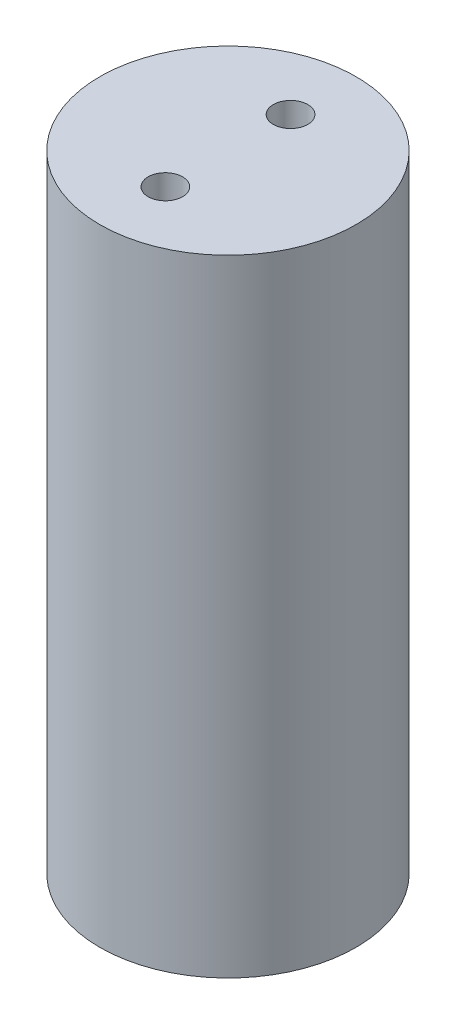
ISO-10303-21;
HEADER;
FILE_DESCRIPTION(('STEP AP214'),'2;1');
FILE_NAME('part.step','',(''),(''),'','','');
FILE_SCHEMA(('AUTOMOTIVE_DESIGN { 1 0 10303 214 1 1 1 1 }'));
ENDSEC;
DATA;
#1=APPLICATION_CONTEXT('core data for automotive mechanical design processes');
#2=APPLICATION_PROTOCOL_DEFINITION('international standard','automotive_design',2000,#1);
#3=PRODUCT_CONTEXT('',#1,'mechanical');
#4=PRODUCT('Part','Part','',(#3));
#5=PRODUCT_RELATED_PRODUCT_CATEGORY('part','',(#4));
#6=PRODUCT_DEFINITION_FORMATION('','',#4);
#7=PRODUCT_DEFINITION_CONTEXT('part definition',#1,'design');
#8=PRODUCT_DEFINITION('design','',#6,#7);
#9=PRODUCT_DEFINITION_SHAPE('','',#8);
#10=(LENGTH_UNIT() NAMED_UNIT(*) SI_UNIT(.MILLI.,.METRE.));
#11=(NAMED_UNIT(*) PLANE_ANGLE_UNIT() SI_UNIT($,.RADIAN.));
#12=(NAMED_UNIT(*) SI_UNIT($,.STERADIAN.) SOLID_ANGLE_UNIT());
#13=UNCERTAINTY_MEASURE_WITH_UNIT(LENGTH_MEASURE(1.E-05),#10,'distance_accuracy_value','');
#14=(GEOMETRIC_REPRESENTATION_CONTEXT(3) GLOBAL_UNCERTAINTY_ASSIGNED_CONTEXT((#13)) GLOBAL_UNIT_ASSIGNED_CONTEXT((#10,
#11,#12)) REPRESENTATION_CONTEXT('',''));
#15=CARTESIAN_POINT('',(0.,0.,0.));
#16=DIRECTION('',(0.,0.,1.));
#17=DIRECTION('',(1.,0.,0.));
#18=AXIS2_PLACEMENT_3D('',#15,#16,#17);
#19=CARTESIAN_POINT('',(0.,6.35,0.));
#20=DIRECTION('',(0.,-1.,0.));
#21=DIRECTION('',(0.,0.,-1.));
#22=AXIS2_PLACEMENT_3D('',#19,#20,#21);
#23=CYLINDRICAL_SURFACE('',#22,2.6);
#24=CARTESIAN_POINT('',(0.,6.35,0.));
#25=DIRECTION('',(0.,1.,0.));
#26=DIRECTION('',(0.,0.,1.));
#27=AXIS2_PLACEMENT_3D('',#24,#25,#26);
#28=CIRCLE('',#27,2.6);
#29=CARTESIAN_POINT('',(0.,6.35,2.6));
#30=VERTEX_POINT('',#29);
#31=EDGE_CURVE('E10',#30,#30,#28,.T.);
#32=ORIENTED_EDGE('',*,*,#31,.F.);
#33=EDGE_LOOP('',(#32));
#34=FACE_BOUND('',#33,.T.);
#35=CARTESIAN_POINT('',(0.,-6.35,0.));
#36=DIRECTION('',(0.,1.,0.));
#37=DIRECTION('',(0.,0.,1.));
#38=AXIS2_PLACEMENT_3D('',#35,#36,#37);
#39=CIRCLE('',#38,2.6);
#40=CARTESIAN_POINT('',(0.,-6.35,2.6));
#41=VERTEX_POINT('',#40);
#42=EDGE_CURVE('E33',#41,#41,#39,.T.);
#43=ORIENTED_EDGE('',*,*,#42,.T.);
#44=EDGE_LOOP('',(#43));
#45=FACE_BOUND('',#44,.T.);
#46=ADVANCED_FACE('F30',(#34,#45),#23,.T.);
#47=CARTESIAN_POINT('',(0.,6.35,0.));
#48=DIRECTION('',(0.,1.,0.));
#49=DIRECTION('',(0.,0.,1.));
#50=AXIS2_PLACEMENT_3D('',#47,#48,#49);
#51=PLANE('',#50);
#52=CARTESIAN_POINT('',(0.,6.35,-1.27));
#53=DIRECTION('',(0.,1.,0.));
#54=DIRECTION('',(0.,0.,1.));
#55=AXIS2_PLACEMENT_3D('',#52,#53,#54);
#56=CIRCLE('',#55,0.35);
#57=CARTESIAN_POINT('',(0.,6.35,-0.92));
#58=VERTEX_POINT('',#57);
#59=EDGE_CURVE('E48',#58,#58,#56,.T.);
#60=ORIENTED_EDGE('',*,*,#59,.F.);
#61=EDGE_LOOP('',(#60));
#62=FACE_BOUND('',#61,.T.);
#63=CARTESIAN_POINT('',(0.,6.35,1.27));
#64=DIRECTION('',(0.,1.,0.));
#65=DIRECTION('',(0.,0.,1.));
#66=AXIS2_PLACEMENT_3D('',#63,#64,#65);
#67=CIRCLE('',#66,0.35);
#68=CARTESIAN_POINT('',(0.,6.35,1.62));
#69=VERTEX_POINT('',#68);
#70=EDGE_CURVE('E42',#69,#69,#67,.T.);
#71=ORIENTED_EDGE('',*,*,#70,.F.);
#72=EDGE_LOOP('',(#71));
#73=FACE_BOUND('',#72,.T.);
#74=ORIENTED_EDGE('',*,*,#31,.T.);
#75=EDGE_LOOP('',(#74));
#76=FACE_BOUND('',#75,.T.);
#77=ADVANCED_FACE('F64',(#62,#73,#76),#51,.T.);
#78=CARTESIAN_POINT('',(0.,-6.35,0.));
#79=DIRECTION('',(0.,1.,0.));
#80=DIRECTION('',(0.,0.,1.));
#81=AXIS2_PLACEMENT_3D('',#78,#79,#80);
#82=PLANE('',#81);
#83=CARTESIAN_POINT('',(0.,-6.35,-1.27));
#84=DIRECTION('',(0.,1.,0.));
#85=DIRECTION('',(0.,0.,1.));
#86=AXIS2_PLACEMENT_3D('',#83,#84,#85);
#87=CIRCLE('',#86,0.35);
#88=CARTESIAN_POINT('',(0.,-6.35,-0.92));
#89=VERTEX_POINT('',#88);
#90=EDGE_CURVE('E45',#89,#89,#87,.T.);
#91=ORIENTED_EDGE('',*,*,#90,.T.);
#92=EDGE_LOOP('',(#91));
#93=FACE_BOUND('',#92,.T.);
#94=CARTESIAN_POINT('',(0.,-6.35,1.27));
#95=DIRECTION('',(0.,1.,0.));
#96=DIRECTION('',(0.,0.,1.));
#97=AXIS2_PLACEMENT_3D('',#94,#95,#96);
#98=CIRCLE('',#97,0.35);
#99=CARTESIAN_POINT('',(0.,-6.35,1.62));
#100=VERTEX_POINT('',#99);
#101=EDGE_CURVE('E40',#100,#100,#98,.T.);
#102=ORIENTED_EDGE('',*,*,#101,.T.);
#103=EDGE_LOOP('',(#102));
#104=FACE_BOUND('',#103,.T.);
#105=ORIENTED_EDGE('',*,*,#42,.F.);
#106=EDGE_LOOP('',(#105));
#107=FACE_BOUND('',#106,.T.);
#108=ADVANCED_FACE('F54',(#93,#104,#107),#82,.F.);
#109=CARTESIAN_POINT('',(0.,-6.35,1.27));
#110=DIRECTION('',(0.,1.,0.));
#111=DIRECTION('',(0.,0.,1.));
#112=AXIS2_PLACEMENT_3D('',#109,#110,#111);
#113=CYLINDRICAL_SURFACE('',#112,0.35);
#114=ORIENTED_EDGE('',*,*,#101,.F.);
#115=EDGE_LOOP('',(#114));
#116=FACE_BOUND('',#115,.T.);
#117=ORIENTED_EDGE('',*,*,#70,.T.);
#118=EDGE_LOOP('',(#117));
#119=FACE_BOUND('',#118,.T.);
#120=ADVANCED_FACE('F60',(#116,#119),#113,.F.);
#121=CARTESIAN_POINT('',(0.,-6.35,-1.27));
#122=DIRECTION('',(0.,1.,0.));
#123=DIRECTION('',(0.,0.,1.));
#124=AXIS2_PLACEMENT_3D('',#121,#122,#123);
#125=CYLINDRICAL_SURFACE('',#124,0.35);
#126=ORIENTED_EDGE('',*,*,#90,.F.);
#127=EDGE_LOOP('',(#126));
#128=FACE_BOUND('',#127,.T.);
#129=ORIENTED_EDGE('',*,*,#59,.T.);
#130=EDGE_LOOP('',(#129));
#131=FACE_BOUND('',#130,.T.);
#132=ADVANCED_FACE('F57',(#128,#131),#125,.F.);
#133=CLOSED_SHELL('',(#46,#77,#108,#120,#132));
#134=MANIFOLD_SOLID_BREP('B2',#133);
#135=ADVANCED_BREP_SHAPE_REPRESENTATION('',(#18,#134),#14);
#136=SHAPE_DEFINITION_REPRESENTATION(#9,#135);
ENDSEC;
END-ISO-10303-21;
